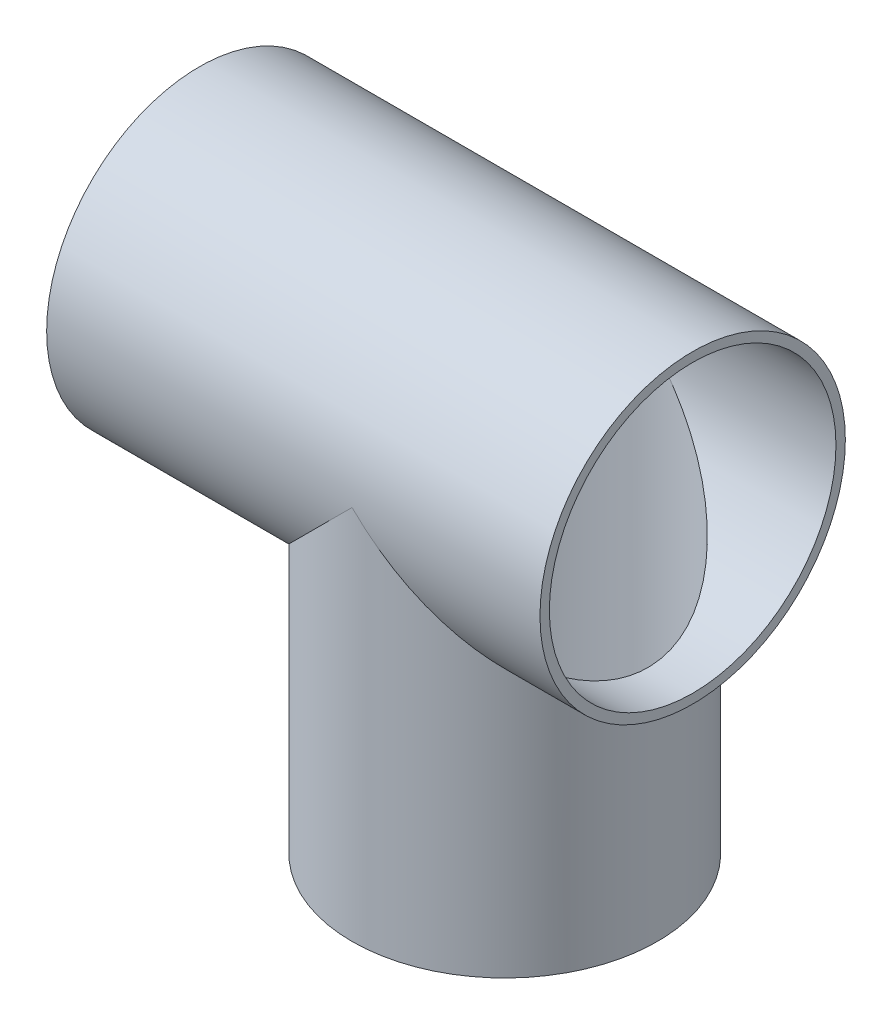
ISO-10303-21;
HEADER;
FILE_DESCRIPTION(('STEP AP214'),'2;1');
FILE_NAME('part.step','',(''),(''),'','','');
FILE_SCHEMA(('AUTOMOTIVE_DESIGN { 1 0 10303 214 1 1 1 1 }'));
ENDSEC;
DATA;
#1=APPLICATION_CONTEXT('core data for automotive mechanical design processes');
#2=APPLICATION_PROTOCOL_DEFINITION('international standard','automotive_design',2000,#1);
#3=PRODUCT_CONTEXT('',#1,'mechanical');
#4=PRODUCT('Part','Part','',(#3));
#5=PRODUCT_RELATED_PRODUCT_CATEGORY('part','',(#4));
#6=PRODUCT_DEFINITION_FORMATION('','',#4);
#7=PRODUCT_DEFINITION_CONTEXT('part definition',#1,'design');
#8=PRODUCT_DEFINITION('design','',#6,#7);
#9=PRODUCT_DEFINITION_SHAPE('','',#8);
#10=(LENGTH_UNIT() NAMED_UNIT(*) SI_UNIT(.MILLI.,.METRE.));
#11=(NAMED_UNIT(*) PLANE_ANGLE_UNIT() SI_UNIT($,.RADIAN.));
#12=(NAMED_UNIT(*) SI_UNIT($,.STERADIAN.) SOLID_ANGLE_UNIT());
#13=UNCERTAINTY_MEASURE_WITH_UNIT(LENGTH_MEASURE(1.E-05),#10,'distance_accuracy_value','');
#14=(GEOMETRIC_REPRESENTATION_CONTEXT(3) GLOBAL_UNCERTAINTY_ASSIGNED_CONTEXT((#13)) GLOBAL_UNIT_ASSIGNED_CONTEXT((#10,
#11,#12)) REPRESENTATION_CONTEXT('',''));
#15=CARTESIAN_POINT('',(0.,0.,0.));
#16=DIRECTION('',(0.,0.,1.));
#17=DIRECTION('',(1.,0.,0.));
#18=AXIS2_PLACEMENT_3D('',#15,#16,#17);
#19=CARTESIAN_POINT('',(-40.,0.,0.));
#20=DIRECTION('',(1.,0.,0.));
#21=DIRECTION('',(0.,0.,-1.));
#22=AXIS2_PLACEMENT_3D('',#19,#20,#21);
#23=CYLINDRICAL_SURFACE('',#22,30.5);
#24=CARTESIAN_POINT('',(40.,0.,0.));
#25=DIRECTION('',(1.,0.,0.));
#26=DIRECTION('',(0.,0.,-1.));
#27=AXIS2_PLACEMENT_3D('',#24,#25,#26);
#28=CIRCLE('',#27,30.5);
#29=CARTESIAN_POINT('',(40.,0.,-30.5));
#30=VERTEX_POINT('',#29);
#31=EDGE_CURVE('E97',#30,#30,#28,.T.);
#32=ORIENTED_EDGE('',*,*,#31,.T.);
#33=EDGE_LOOP('',(#32));
#34=FACE_BOUND('',#33,.T.);
#35=DIRECTION('',(1.,0.,0.));
#36=VECTOR('',#35,1.);
#37=CARTESIAN_POINT('',(-40.,-1.00000000000001,-30.4836021493524));
#38=LINE('',#37,#36);
#39=CARTESIAN_POINT('',(1.00000000000012,-1.00000000000001,-30.4836021493524));
#40=VERTEX_POINT('',#39);
#41=CARTESIAN_POINT('',(-1.00000000000012,-1.00000000000001,-30.4836021493524));
#42=VERTEX_POINT('',#41);
#43=EDGE_CURVE('E11',#40,#42,#38,.F.);
#44=ORIENTED_EDGE('',*,*,#43,.F.);
#45=CARTESIAN_POINT('',(0.,0.,0.));
#46=DIRECTION('',(0.707106781186547,0.707106781186547,0.));
#47=DIRECTION('',(0.707106781186547,-0.707106781186547,0.));
#48=AXIS2_PLACEMENT_3D('',#45,#46,#47);
#49=ELLIPSE('',#48,43.1335136523794,30.5);
#50=CARTESIAN_POINT('',(1.00000000000012,-1.00000000000001,30.4836021493524));
#51=VERTEX_POINT('',#50);
#52=EDGE_CURVE('E71',#40,#51,#49,.F.);
#53=ORIENTED_EDGE('',*,*,#52,.T.);
#54=DIRECTION('',(1.,0.,0.));
#55=VECTOR('',#54,1.);
#56=CARTESIAN_POINT('',(-40.,-1.00000000000001,30.4836021493524));
#57=LINE('',#56,#55);
#58=CARTESIAN_POINT('',(-1.00000000000012,-1.00000000000001,30.4836021493524));
#59=VERTEX_POINT('',#58);
#60=EDGE_CURVE('E45',#59,#51,#57,.T.);
#61=ORIENTED_EDGE('',*,*,#60,.F.);
#62=CARTESIAN_POINT('',(0.,0.,0.));
#63=DIRECTION('',(0.707106781186547,-0.707106781186547,0.));
#64=DIRECTION('',(0.707106781186547,0.707106781186547,0.));
#65=AXIS2_PLACEMENT_3D('',#62,#63,#64);
#66=ELLIPSE('',#65,43.1335136523794,30.5);
#67=EDGE_CURVE('E79',#59,#42,#66,.T.);
#68=ORIENTED_EDGE('',*,*,#67,.T.);
#69=EDGE_LOOP('',(#44,#53,#61,#68));
#70=FACE_BOUND('',#69,.T.);
#71=CARTESIAN_POINT('',(-65.,0.,0.));
#72=DIRECTION('',(-1.,0.,0.));
#73=DIRECTION('',(0.,0.,1.));
#74=AXIS2_PLACEMENT_3D('',#71,#72,#73);
#75=CIRCLE('',#74,30.5);
#76=CARTESIAN_POINT('',(-65.,0.,30.5));
#77=VERTEX_POINT('',#76);
#78=EDGE_CURVE('E143',#77,#77,#75,.T.);
#79=ORIENTED_EDGE('',*,*,#78,.T.);
#80=EDGE_LOOP('',(#79));
#81=FACE_BOUND('',#80,.T.);
#82=ADVANCED_FACE('F37',(#34,#70,#81),#23,.F.);
#83=CARTESIAN_POINT('',(-40.,0.,0.));
#84=DIRECTION('',(1.,0.,0.));
#85=DIRECTION('',(0.,0.,-1.));
#86=AXIS2_PLACEMENT_3D('',#83,#84,#85);
#87=CYLINDRICAL_SURFACE('',#86,32.5);
#88=CARTESIAN_POINT('',(0.,0.,0.));
#89=DIRECTION('',(0.707106781186547,0.707106781186547,0.));
#90=DIRECTION('',(0.707106781186547,-0.707106781186547,0.));
#91=AXIS2_PLACEMENT_3D('',#88,#89,#90);
#92=ELLIPSE('',#91,45.9619407771256,32.5);
#93=CARTESIAN_POINT('',(0.,0.,-32.5));
#94=VERTEX_POINT('',#93);
#95=CARTESIAN_POINT('',(0.,0.,32.5));
#96=VERTEX_POINT('',#95);
#97=EDGE_CURVE('E95',#94,#96,#92,.F.);
#98=ORIENTED_EDGE('',*,*,#97,.F.);
#99=CARTESIAN_POINT('',(0.,0.,0.));
#100=DIRECTION('',(0.707106781186547,-0.707106781186547,0.));
#101=DIRECTION('',(0.707106781186547,0.707106781186547,0.));
#102=AXIS2_PLACEMENT_3D('',#99,#100,#101);
#103=ELLIPSE('',#102,45.9619407771256,32.5);
#104=EDGE_CURVE('E58',#96,#94,#103,.T.);
#105=ORIENTED_EDGE('',*,*,#104,.F.);
#106=EDGE_LOOP('',(#98,#105));
#107=FACE_BOUND('',#106,.T.);
#108=CARTESIAN_POINT('',(40.,0.,0.));
#109=DIRECTION('',(1.,0.,0.));
#110=DIRECTION('',(0.,0.,-1.));
#111=AXIS2_PLACEMENT_3D('',#108,#109,#110);
#112=CIRCLE('',#111,32.5);
#113=CARTESIAN_POINT('',(40.,0.,-32.5));
#114=VERTEX_POINT('',#113);
#115=EDGE_CURVE('E100',#114,#114,#112,.T.);
#116=ORIENTED_EDGE('',*,*,#115,.F.);
#117=EDGE_LOOP('',(#116));
#118=FACE_BOUND('',#117,.T.);
#119=CARTESIAN_POINT('',(-65.,0.,0.));
#120=DIRECTION('',(-1.,0.,0.));
#121=DIRECTION('',(0.,0.,1.));
#122=AXIS2_PLACEMENT_3D('',#119,#120,#121);
#123=CIRCLE('',#122,32.5);
#124=CARTESIAN_POINT('',(-65.,0.,32.5));
#125=VERTEX_POINT('',#124);
#126=EDGE_CURVE('E83',#125,#125,#123,.T.);
#127=ORIENTED_EDGE('',*,*,#126,.F.);
#128=EDGE_LOOP('',(#127));
#129=FACE_BOUND('',#128,.T.);
#130=ADVANCED_FACE('F39',(#107,#118,#129),#87,.T.);
#131=CARTESIAN_POINT('',(40.,0.,0.));
#132=DIRECTION('',(1.,0.,0.));
#133=DIRECTION('',(0.,0.,-1.));
#134=AXIS2_PLACEMENT_3D('',#131,#132,#133);
#135=PLANE('',#134);
#136=ORIENTED_EDGE('',*,*,#115,.T.);
#137=EDGE_LOOP('',(#136));
#138=FACE_BOUND('',#137,.T.);
#139=ORIENTED_EDGE('',*,*,#31,.F.);
#140=EDGE_LOOP('',(#139));
#141=FACE_BOUND('',#140,.T.);
#142=ADVANCED_FACE('F118',(#138,#141),#135,.T.);
#143=CARTESIAN_POINT('',(0.,-80.,0.));
#144=DIRECTION('',(0.,1.,0.));
#145=DIRECTION('',(0.,0.,1.));
#146=AXIS2_PLACEMENT_3D('',#143,#144,#145);
#147=CYLINDRICAL_SURFACE('',#146,32.5);
#148=CARTESIAN_POINT('',(0.,-80.,0.));
#149=DIRECTION('',(0.,1.,0.));
#150=DIRECTION('',(0.,0.,1.));
#151=AXIS2_PLACEMENT_3D('',#148,#149,#150);
#152=CIRCLE('',#151,32.5);
#153=CARTESIAN_POINT('',(0.,-80.,32.5));
#154=VERTEX_POINT('',#153);
#155=EDGE_CURVE('E89',#154,#154,#152,.T.);
#156=ORIENTED_EDGE('',*,*,#155,.T.);
#157=EDGE_LOOP('',(#156));
#158=FACE_BOUND('',#157,.T.);
#159=ORIENTED_EDGE('',*,*,#104,.T.);
#160=ORIENTED_EDGE('',*,*,#97,.T.);
#161=EDGE_LOOP('',(#159,#160));
#162=FACE_BOUND('',#161,.T.);
#163=ADVANCED_FACE('F122',(#158,#162),#147,.T.);
#164=CARTESIAN_POINT('',(0.,-80.,0.));
#165=DIRECTION('',(0.,1.,0.));
#166=DIRECTION('',(0.,0.,1.));
#167=AXIS2_PLACEMENT_3D('',#164,#165,#166);
#168=PLANE('',#167);
#169=CARTESIAN_POINT('',(0.,-80.,0.));
#170=DIRECTION('',(0.,1.,0.));
#171=DIRECTION('',(0.,0.,1.));
#172=AXIS2_PLACEMENT_3D('',#169,#170,#171);
#173=CIRCLE('',#172,30.5);
#174=CARTESIAN_POINT('',(0.,-80.,30.5));
#175=VERTEX_POINT('',#174);
#176=EDGE_CURVE('E86',#175,#175,#173,.T.);
#177=ORIENTED_EDGE('',*,*,#176,.T.);
#178=EDGE_LOOP('',(#177));
#179=FACE_BOUND('',#178,.T.);
#180=ORIENTED_EDGE('',*,*,#155,.F.);
#181=EDGE_LOOP('',(#180));
#182=FACE_BOUND('',#181,.T.);
#183=ADVANCED_FACE('F126',(#179,#182),#168,.F.);
#184=CARTESIAN_POINT('',(0.,-80.,0.));
#185=DIRECTION('',(0.,1.,0.));
#186=DIRECTION('',(0.,0.,1.));
#187=AXIS2_PLACEMENT_3D('',#184,#185,#186);
#188=CYLINDRICAL_SURFACE('',#187,30.5);
#189=ORIENTED_EDGE('',*,*,#176,.F.);
#190=EDGE_LOOP('',(#189));
#191=FACE_BOUND('',#190,.T.);
#192=CARTESIAN_POINT('',(0.,-1.00000000000001,0.));
#193=DIRECTION('',(0.,-1.,0.));
#194=DIRECTION('',(0.,0.,-1.));
#195=AXIS2_PLACEMENT_3D('',#192,#193,#194);
#196=CIRCLE('',#195,30.5);
#197=EDGE_CURVE('E51',#51,#59,#196,.T.);
#198=ORIENTED_EDGE('',*,*,#197,.F.);
#199=ORIENTED_EDGE('',*,*,#52,.F.);
#200=EDGE_CURVE('E74',#42,#40,#196,.T.);
#201=ORIENTED_EDGE('',*,*,#200,.F.);
#202=ORIENTED_EDGE('',*,*,#67,.F.);
#203=EDGE_LOOP('',(#198,#199,#201,#202));
#204=FACE_BOUND('',#203,.T.);
#205=ADVANCED_FACE('F73',(#191,#204),#188,.F.);
#206=CARTESIAN_POINT('',(0.,-1.00000000000001,0.));
#207=DIRECTION('',(0.,-1.,0.));
#208=DIRECTION('',(0.,0.,-1.));
#209=AXIS2_PLACEMENT_3D('',#206,#207,#208);
#210=PLANE('',#209);
#211=ORIENTED_EDGE('',*,*,#43,.T.);
#212=ORIENTED_EDGE('',*,*,#200,.T.);
#213=EDGE_LOOP('',(#211,#212));
#214=FACE_BOUND('',#213,.T.);
#215=ADVANCED_FACE('F82',(#214),#210,.T.);
#216=ORIENTED_EDGE('',*,*,#60,.T.);
#217=ORIENTED_EDGE('',*,*,#197,.T.);
#218=EDGE_LOOP('',(#216,#217));
#219=FACE_BOUND('',#218,.T.);
#220=ADVANCED_FACE('F102',(#219),#210,.T.);
#221=CARTESIAN_POINT('',(-65.,0.,0.));
#222=DIRECTION('',(-1.,0.,0.));
#223=DIRECTION('',(0.,0.,1.));
#224=AXIS2_PLACEMENT_3D('',#221,#222,#223);
#225=PLANE('',#224);
#226=ORIENTED_EDGE('',*,*,#126,.T.);
#227=EDGE_LOOP('',(#226));
#228=FACE_BOUND('',#227,.T.);
#229=ORIENTED_EDGE('',*,*,#78,.F.);
#230=EDGE_LOOP('',(#229));
#231=FACE_BOUND('',#230,.T.);
#232=ADVANCED_FACE('F104',(#228,#231),#225,.T.);
#233=CLOSED_SHELL('',(#82,#130,#142,#163,#183,#205,#215,#220,#232));
#234=MANIFOLD_SOLID_BREP('B2',#233);
#235=ADVANCED_BREP_SHAPE_REPRESENTATION('',(#18,#234),#14);
#236=SHAPE_DEFINITION_REPRESENTATION(#9,#235);
ENDSEC;
END-ISO-10303-21;
